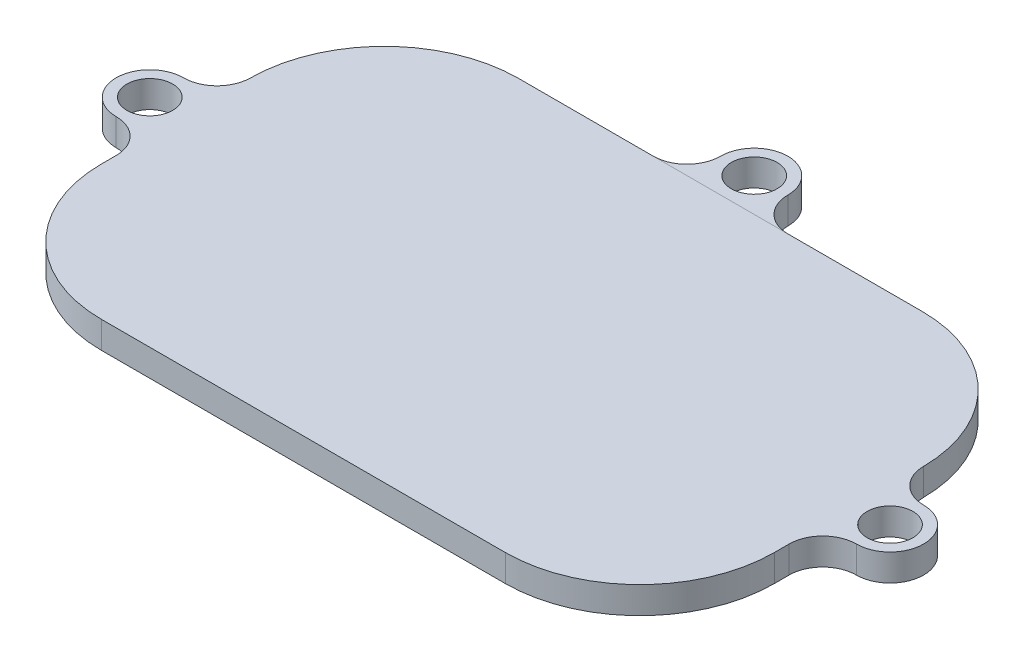
ISO-10303-21;
HEADER;
FILE_DESCRIPTION(('STEP AP214'),'2;1');
FILE_NAME('part.step','',(''),(''),'','','');
FILE_SCHEMA(('AUTOMOTIVE_DESIGN { 1 0 10303 214 1 1 1 1 }'));
ENDSEC;
DATA;
#1=APPLICATION_CONTEXT('core data for automotive mechanical design processes');
#2=APPLICATION_PROTOCOL_DEFINITION('international standard','automotive_design',2000,#1);
#3=PRODUCT_CONTEXT('',#1,'mechanical');
#4=PRODUCT('Part','Part','',(#3));
#5=PRODUCT_RELATED_PRODUCT_CATEGORY('part','',(#4));
#6=PRODUCT_DEFINITION_FORMATION('','',#4);
#7=PRODUCT_DEFINITION_CONTEXT('part definition',#1,'design');
#8=PRODUCT_DEFINITION('design','',#6,#7);
#9=PRODUCT_DEFINITION_SHAPE('','',#8);
#10=(LENGTH_UNIT() NAMED_UNIT(*) SI_UNIT(.MILLI.,.METRE.));
#11=(NAMED_UNIT(*) PLANE_ANGLE_UNIT() SI_UNIT($,.RADIAN.));
#12=(NAMED_UNIT(*) SI_UNIT($,.STERADIAN.) SOLID_ANGLE_UNIT());
#13=UNCERTAINTY_MEASURE_WITH_UNIT(LENGTH_MEASURE(1.E-05),#10,'distance_accuracy_value','');
#14=(GEOMETRIC_REPRESENTATION_CONTEXT(3) GLOBAL_UNCERTAINTY_ASSIGNED_CONTEXT((#13)) GLOBAL_UNIT_ASSIGNED_CONTEXT((#10,
#11,#12)) REPRESENTATION_CONTEXT('',''));
#15=CARTESIAN_POINT('',(0.,0.,0.));
#16=DIRECTION('',(0.,0.,1.));
#17=DIRECTION('',(1.,0.,0.));
#18=AXIS2_PLACEMENT_3D('',#15,#16,#17);
#19=CARTESIAN_POINT('',(-5.,-11.180339887499,-18.));
#20=DIRECTION('',(0.,1.,0.));
#21=DIRECTION('',(0.,0.,1.));
#22=AXIS2_PLACEMENT_3D('',#19,#20,#21);
#23=CYLINDRICAL_SURFACE('',#22,2.5);
#24=CARTESIAN_POINT('',(-5.,0.,-18.));
#25=DIRECTION('',(0.,1.,0.));
#26=DIRECTION('',(0.,0.,1.));
#27=AXIS2_PLACEMENT_3D('',#24,#25,#26);
#28=CIRCLE('',#27,2.5);
#29=CARTESIAN_POINT('',(-5.,0.,-15.5));
#30=VERTEX_POINT('',#29);
#31=CARTESIAN_POINT('',(-2.5,0.,-18.));
#32=VERTEX_POINT('',#31);
#33=EDGE_CURVE('E55',#30,#32,#28,.T.);
#34=ORIENTED_EDGE('',*,*,#33,.F.);
#35=DIRECTION('',(0.,1.,0.));
#36=VECTOR('',#35,1.);
#37=CARTESIAN_POINT('',(-5.,-11.180339887499,-15.5));
#38=LINE('',#37,#36);
#39=CARTESIAN_POINT('',(-5.,2.,-15.5));
#40=VERTEX_POINT('',#39);
#41=EDGE_CURVE('E83',#30,#40,#38,.T.);
#42=ORIENTED_EDGE('',*,*,#41,.T.);
#43=CARTESIAN_POINT('',(-5.,2.,-18.));
#44=DIRECTION('',(0.,-1.,0.));
#45=DIRECTION('',(0.,0.,1.));
#46=AXIS2_PLACEMENT_3D('',#43,#44,#45);
#47=CIRCLE('',#46,2.5);
#48=CARTESIAN_POINT('',(-2.5,2.,-18.));
#49=VERTEX_POINT('',#48);
#50=EDGE_CURVE('E87',#49,#40,#47,.T.);
#51=ORIENTED_EDGE('',*,*,#50,.F.);
#52=DIRECTION('',(0.,1.,0.));
#53=VECTOR('',#52,1.);
#54=CARTESIAN_POINT('',(-2.5,-11.180339887499,-18.));
#55=LINE('',#54,#53);
#56=EDGE_CURVE('E114',#32,#49,#55,.T.);
#57=ORIENTED_EDGE('',*,*,#56,.F.);
#58=EDGE_LOOP('',(#34,#42,#51,#57));
#59=FACE_BOUND('',#58,.T.);
#60=ADVANCED_FACE('F47',(#59),#23,.F.);
#61=CARTESIAN_POINT('',(0.,-11.180339887499,-18.));
#62=DIRECTION('',(0.,1.,0.));
#63=DIRECTION('',(0.,0.,1.));
#64=AXIS2_PLACEMENT_3D('',#61,#62,#63);
#65=CYLINDRICAL_SURFACE('',#64,2.5);
#66=CARTESIAN_POINT('',(0.,0.,-18.));
#67=DIRECTION('',(0.,1.,0.));
#68=DIRECTION('',(0.,0.,1.));
#69=AXIS2_PLACEMENT_3D('',#66,#67,#68);
#70=CIRCLE('',#69,2.5);
#71=CARTESIAN_POINT('',(2.5,0.,-18.));
#72=VERTEX_POINT('',#71);
#73=EDGE_CURVE('E61',#32,#72,#70,.F.);
#74=ORIENTED_EDGE('',*,*,#73,.F.);
#75=ORIENTED_EDGE('',*,*,#56,.T.);
#76=CARTESIAN_POINT('',(0.,2.,-18.));
#77=DIRECTION('',(0.,1.,0.));
#78=DIRECTION('',(0.,0.,1.));
#79=AXIS2_PLACEMENT_3D('',#76,#77,#78);
#80=CIRCLE('',#79,2.5);
#81=CARTESIAN_POINT('',(2.5,2.,-18.));
#82=VERTEX_POINT('',#81);
#83=EDGE_CURVE('E92',#82,#49,#80,.T.);
#84=ORIENTED_EDGE('',*,*,#83,.F.);
#85=DIRECTION('',(0.,1.,0.));
#86=VECTOR('',#85,1.);
#87=CARTESIAN_POINT('',(2.5,-11.180339887499,-18.));
#88=LINE('',#87,#86);
#89=EDGE_CURVE('E117',#72,#82,#88,.T.);
#90=ORIENTED_EDGE('',*,*,#89,.F.);
#91=EDGE_LOOP('',(#74,#75,#84,#90));
#92=FACE_BOUND('',#91,.T.);
#93=ADVANCED_FACE('F123',(#92),#65,.T.);
#94=CARTESIAN_POINT('',(5.,-11.180339887499,-18.));
#95=DIRECTION('',(0.,1.,0.));
#96=DIRECTION('',(0.,0.,1.));
#97=AXIS2_PLACEMENT_3D('',#94,#95,#96);
#98=CYLINDRICAL_SURFACE('',#97,2.5);
#99=CARTESIAN_POINT('',(5.,0.,-18.));
#100=DIRECTION('',(0.,1.,0.));
#101=DIRECTION('',(0.,0.,1.));
#102=AXIS2_PLACEMENT_3D('',#99,#100,#101);
#103=CIRCLE('',#102,2.5);
#104=CARTESIAN_POINT('',(5.,0.,-15.5));
#105=VERTEX_POINT('',#104);
#106=EDGE_CURVE('E116',#72,#105,#103,.T.);
#107=ORIENTED_EDGE('',*,*,#106,.F.);
#108=ORIENTED_EDGE('',*,*,#89,.T.);
#109=CARTESIAN_POINT('',(5.,2.,-18.));
#110=DIRECTION('',(0.,-1.,0.));
#111=DIRECTION('',(0.,0.,-1.));
#112=AXIS2_PLACEMENT_3D('',#109,#110,#111);
#113=CIRCLE('',#112,2.5);
#114=CARTESIAN_POINT('',(5.,2.,-15.5));
#115=VERTEX_POINT('',#114);
#116=EDGE_CURVE('E100',#115,#82,#113,.T.);
#117=ORIENTED_EDGE('',*,*,#116,.F.);
#118=DIRECTION('',(0.,1.,0.));
#119=VECTOR('',#118,1.);
#120=CARTESIAN_POINT('',(5.,-11.180339887499,-15.5));
#121=LINE('',#120,#119);
#122=EDGE_CURVE('E91',#105,#115,#121,.T.);
#123=ORIENTED_EDGE('',*,*,#122,.F.);
#124=EDGE_LOOP('',(#107,#108,#117,#123));
#125=FACE_BOUND('',#124,.T.);
#126=ADVANCED_FACE('F121',(#125),#98,.F.);
#127=CARTESIAN_POINT('',(-5.,-11.180339887499,-15.5));
#128=DIRECTION('',(0.,0.,1.));
#129=DIRECTION('',(1.,0.,0.));
#130=AXIS2_PLACEMENT_3D('',#127,#128,#129);
#131=PLANE('',#130);
#132=DIRECTION('',(-1.,0.,0.));
#133=VECTOR('',#132,1.);
#134=CARTESIAN_POINT('',(-5.,0.,-15.5));
#135=LINE('',#134,#133);
#136=EDGE_CURVE('E12',#105,#30,#135,.T.);
#137=ORIENTED_EDGE('',*,*,#136,.F.);
#138=ORIENTED_EDGE('',*,*,#122,.T.);
#139=DIRECTION('',(1.,0.,0.));
#140=VECTOR('',#139,1.);
#141=CARTESIAN_POINT('',(-5.,2.,-15.5));
#142=LINE('',#141,#140);
#143=EDGE_CURVE('E94',#40,#115,#142,.T.);
#144=ORIENTED_EDGE('',*,*,#143,.F.);
#145=ORIENTED_EDGE('',*,*,#41,.F.);
#146=EDGE_LOOP('',(#137,#138,#144,#145));
#147=FACE_BOUND('',#146,.T.);
#148=ADVANCED_FACE('F95',(#147),#131,.T.);
#149=CARTESIAN_POINT('',(-5.,2.,-18.));
#150=DIRECTION('',(0.,1.,0.));
#151=DIRECTION('',(0.,0.,1.));
#152=AXIS2_PLACEMENT_3D('',#149,#150,#151);
#153=PLANE('',#152);
#154=CARTESIAN_POINT('',(0.,2.,-18.));
#155=DIRECTION('',(0.,1.,0.));
#156=DIRECTION('',(0.,0.,1.));
#157=AXIS2_PLACEMENT_3D('',#154,#155,#156);
#158=CIRCLE('',#157,1.69999999999999);
#159=CARTESIAN_POINT('',(0.,2.,-16.3));
#160=VERTEX_POINT('',#159);
#161=EDGE_CURVE('E107',#160,#160,#158,.T.);
#162=ORIENTED_EDGE('',*,*,#161,.F.);
#163=EDGE_LOOP('',(#162));
#164=FACE_BOUND('',#163,.T.);
#165=ORIENTED_EDGE('',*,*,#50,.T.);
#166=ORIENTED_EDGE('',*,*,#143,.T.);
#167=ORIENTED_EDGE('',*,*,#116,.T.);
#168=ORIENTED_EDGE('',*,*,#83,.T.);
#169=EDGE_LOOP('',(#165,#166,#167,#168));
#170=FACE_BOUND('',#169,.T.);
#171=ADVANCED_FACE('F102',(#164,#170),#153,.T.);
#172=CARTESIAN_POINT('',(0.,0.,0.));
#173=DIRECTION('',(0.,1.,0.));
#174=DIRECTION('',(0.,0.,1.));
#175=AXIS2_PLACEMENT_3D('',#172,#173,#174);
#176=PLANE('',#175);
#177=CARTESIAN_POINT('',(0.,0.,-18.));
#178=DIRECTION('',(0.,1.,0.));
#179=DIRECTION('',(0.,0.,1.));
#180=AXIS2_PLACEMENT_3D('',#177,#178,#179);
#181=CIRCLE('',#180,1.7);
#182=CARTESIAN_POINT('',(0.,0.,-16.3));
#183=VERTEX_POINT('',#182);
#184=EDGE_CURVE('E104',#183,#183,#181,.T.);
#185=ORIENTED_EDGE('',*,*,#184,.T.);
#186=EDGE_LOOP('',(#185));
#187=FACE_BOUND('',#186,.T.);
#188=ORIENTED_EDGE('',*,*,#33,.T.);
#189=ORIENTED_EDGE('',*,*,#73,.T.);
#190=ORIENTED_EDGE('',*,*,#106,.T.);
#191=ORIENTED_EDGE('',*,*,#136,.T.);
#192=EDGE_LOOP('',(#188,#189,#190,#191));
#193=FACE_BOUND('',#192,.T.);
#194=ADVANCED_FACE('F132',(#187,#193),#176,.F.);
#195=CARTESIAN_POINT('',(0.,2.,-18.));
#196=DIRECTION('',(0.,1.,0.));
#197=DIRECTION('',(0.,0.,1.));
#198=AXIS2_PLACEMENT_3D('',#195,#196,#197);
#199=CYLINDRICAL_SURFACE('',#198,1.69999999999999);
#200=ORIENTED_EDGE('',*,*,#184,.F.);
#201=EDGE_LOOP('',(#200));
#202=FACE_BOUND('',#201,.T.);
#203=ORIENTED_EDGE('',*,*,#161,.T.);
#204=EDGE_LOOP('',(#203));
#205=FACE_BOUND('',#204,.T.);
#206=ADVANCED_FACE('F129',(#202,#205),#199,.F.);
#207=CLOSED_SHELL('',(#60,#93,#126,#148,#171,#194,#206));
#208=MANIFOLD_SOLID_BREP('B2',#207);
#209=CARTESIAN_POINT('',(25.,2.,-15.5));
#210=DIRECTION('',(-1.,0.,0.));
#211=DIRECTION('',(0.,0.,1.));
#212=AXIS2_PLACEMENT_3D('',#209,#210,#211);
#213=PLANE('',#212);
#214=DIRECTION('',(0.,0.,-1.));
#215=VECTOR('',#214,1.);
#216=CARTESIAN_POINT('',(25.,2.,-15.5));
#217=LINE('',#216,#215);
#218=CARTESIAN_POINT('',(25.,2.,5.5));
#219=VERTEX_POINT('',#218);
#220=CARTESIAN_POINT('',(25.,2.,4.41034837561365));
#221=VERTEX_POINT('',#220);
#222=EDGE_CURVE('E353',#219,#221,#217,.T.);
#223=ORIENTED_EDGE('',*,*,#222,.F.);
#224=DIRECTION('',(0.,-1.,0.));
#225=VECTOR('',#224,1.);
#226=CARTESIAN_POINT('',(25.,2.,5.5));
#227=LINE('',#226,#225);
#228=CARTESIAN_POINT('',(25.,0.,5.5));
#229=VERTEX_POINT('',#228);
#230=EDGE_CURVE('E362',#219,#229,#227,.T.);
#231=ORIENTED_EDGE('',*,*,#230,.T.);
#232=DIRECTION('',(0.,0.,-1.));
#233=VECTOR('',#232,1.);
#234=CARTESIAN_POINT('',(25.,0.,-15.5));
#235=LINE('',#234,#233);
#236=CARTESIAN_POINT('',(25.,0.,4.41034837561365));
#237=VERTEX_POINT('',#236);
#238=EDGE_CURVE('E352',#229,#237,#235,.T.);
#239=ORIENTED_EDGE('',*,*,#238,.T.);
#240=DIRECTION('',(0.,1.,0.));
#241=VECTOR('',#240,1.);
#242=CARTESIAN_POINT('',(25.,-11.1803398874989,4.41034837561365));
#243=LINE('',#242,#241);
#244=EDGE_CURVE('E347',#237,#221,#243,.T.);
#245=ORIENTED_EDGE('',*,*,#244,.T.);
#246=EDGE_LOOP('',(#223,#231,#239,#245));
#247=FACE_BOUND('',#246,.T.);
#248=ADVANCED_FACE('F192',(#247),#213,.F.);
#249=CARTESIAN_POINT('',(-25.,2.,-15.5));
#250=DIRECTION('',(0.,0.,1.));
#251=DIRECTION('',(1.,0.,0.));
#252=AXIS2_PLACEMENT_3D('',#249,#250,#251);
#253=PLANE('',#252);
#254=DIRECTION('',(-1.,0.,0.));
#255=VECTOR('',#254,1.);
#256=CARTESIAN_POINT('',(-25.,2.,-15.5));
#257=LINE('',#256,#255);
#258=CARTESIAN_POINT('',(15.0003215006848,2.,-15.5));
#259=VERTEX_POINT('',#258);
#260=CARTESIAN_POINT('',(-15.0003215006848,2.,-15.5));
#261=VERTEX_POINT('',#260);
#262=EDGE_CURVE('E355',#259,#261,#257,.T.);
#263=ORIENTED_EDGE('',*,*,#262,.F.);
#264=DIRECTION('',(0.,-1.,0.));
#265=VECTOR('',#264,1.);
#266=CARTESIAN_POINT('',(15.0003215006848,0.,-15.5));
#267=LINE('',#266,#265);
#268=CARTESIAN_POINT('',(15.0003215006848,0.,-15.5));
#269=VERTEX_POINT('',#268);
#270=EDGE_CURVE('E396',#259,#269,#267,.T.);
#271=ORIENTED_EDGE('',*,*,#270,.T.);
#272=DIRECTION('',(-1.,0.,0.));
#273=VECTOR('',#272,1.);
#274=CARTESIAN_POINT('',(-25.,0.,-15.5));
#275=LINE('',#274,#273);
#276=CARTESIAN_POINT('',(-15.0003215006848,0.,-15.5));
#277=VERTEX_POINT('',#276);
#278=EDGE_CURVE('E364',#269,#277,#275,.T.);
#279=ORIENTED_EDGE('',*,*,#278,.T.);
#280=DIRECTION('',(0.,-1.,0.));
#281=VECTOR('',#280,1.);
#282=CARTESIAN_POINT('',(-15.0003215006848,2.,-15.5));
#283=LINE('',#282,#281);
#284=EDGE_CURVE('E394',#277,#261,#283,.F.);
#285=ORIENTED_EDGE('',*,*,#284,.T.);
#286=EDGE_LOOP('',(#263,#271,#279,#285));
#287=FACE_BOUND('',#286,.T.);
#288=ADVANCED_FACE('F412',(#287),#253,.F.);
#289=CARTESIAN_POINT('',(-25.,2.,-15.5));
#290=DIRECTION('',(1.,0.,0.));
#291=DIRECTION('',(0.,0.,-1.));
#292=AXIS2_PLACEMENT_3D('',#289,#290,#291);
#293=PLANE('',#292);
#294=DIRECTION('',(0.,0.,1.));
#295=VECTOR('',#294,1.);
#296=CARTESIAN_POINT('',(-25.,0.,-15.5));
#297=LINE('',#296,#295);
#298=CARTESIAN_POINT('',(-25.,0.,4.41034837561365));
#299=VERTEX_POINT('',#298);
#300=CARTESIAN_POINT('',(-25.,0.,5.5));
#301=VERTEX_POINT('',#300);
#302=EDGE_CURVE('E367',#299,#301,#297,.T.);
#303=ORIENTED_EDGE('',*,*,#302,.T.);
#304=DIRECTION('',(0.,-1.,0.));
#305=VECTOR('',#304,1.);
#306=CARTESIAN_POINT('',(-25.,2.,5.5));
#307=LINE('',#306,#305);
#308=CARTESIAN_POINT('',(-25.,2.,5.5));
#309=VERTEX_POINT('',#308);
#310=EDGE_CURVE('E207',#301,#309,#307,.F.);
#311=ORIENTED_EDGE('',*,*,#310,.T.);
#312=DIRECTION('',(0.,0.,1.));
#313=VECTOR('',#312,1.);
#314=CARTESIAN_POINT('',(-25.,2.,-15.5));
#315=LINE('',#314,#313);
#316=CARTESIAN_POINT('',(-25.,2.,4.41034837561365));
#317=VERTEX_POINT('',#316);
#318=EDGE_CURVE('E358',#317,#309,#315,.T.);
#319=ORIENTED_EDGE('',*,*,#318,.F.);
#320=DIRECTION('',(0.,1.,0.));
#321=VECTOR('',#320,1.);
#322=CARTESIAN_POINT('',(-25.,-11.1803398874989,4.41034837561365));
#323=LINE('',#322,#321);
#324=EDGE_CURVE('E322',#299,#317,#323,.T.);
#325=ORIENTED_EDGE('',*,*,#324,.F.);
#326=EDGE_LOOP('',(#303,#311,#319,#325));
#327=FACE_BOUND('',#326,.T.);
#328=ADVANCED_FACE('F429',(#327),#293,.F.);
#329=CARTESIAN_POINT('',(-25.,2.,15.5));
#330=DIRECTION('',(0.,0.,-1.));
#331=DIRECTION('',(-1.,0.,0.));
#332=AXIS2_PLACEMENT_3D('',#329,#330,#331);
#333=PLANE('',#332);
#334=DIRECTION('',(1.,0.,0.));
#335=VECTOR('',#334,1.);
#336=CARTESIAN_POINT('',(-25.,0.,15.5));
#337=LINE('',#336,#335);
#338=CARTESIAN_POINT('',(-15.,0.,15.5));
#339=VERTEX_POINT('',#338);
#340=CARTESIAN_POINT('',(15.,0.,15.5));
#341=VERTEX_POINT('',#340);
#342=EDGE_CURVE('E356',#339,#341,#337,.T.);
#343=ORIENTED_EDGE('',*,*,#342,.T.);
#344=DIRECTION('',(0.,-1.,0.));
#345=VECTOR('',#344,1.);
#346=CARTESIAN_POINT('',(15.,2.,15.5));
#347=LINE('',#346,#345);
#348=CARTESIAN_POINT('',(15.,2.,15.5));
#349=VERTEX_POINT('',#348);
#350=EDGE_CURVE('E384',#341,#349,#347,.F.);
#351=ORIENTED_EDGE('',*,*,#350,.T.);
#352=DIRECTION('',(1.,0.,0.));
#353=VECTOR('',#352,1.);
#354=CARTESIAN_POINT('',(-25.,2.,15.5));
#355=LINE('',#354,#353);
#356=CARTESIAN_POINT('',(-15.,2.,15.5));
#357=VERTEX_POINT('',#356);
#358=EDGE_CURVE('E360',#357,#349,#355,.T.);
#359=ORIENTED_EDGE('',*,*,#358,.F.);
#360=DIRECTION('',(0.,-1.,0.));
#361=VECTOR('',#360,1.);
#362=CARTESIAN_POINT('',(-15.,2.,15.5));
#363=LINE('',#362,#361);
#364=EDGE_CURVE('E381',#357,#339,#363,.T.);
#365=ORIENTED_EDGE('',*,*,#364,.T.);
#366=EDGE_LOOP('',(#343,#351,#359,#365));
#367=FACE_BOUND('',#366,.T.);
#368=ADVANCED_FACE('F448',(#367),#333,.F.);
#369=CARTESIAN_POINT('',(0.,2.,0.));
#370=DIRECTION('',(0.,1.,0.));
#371=DIRECTION('',(0.,0.,1.));
#372=AXIS2_PLACEMENT_3D('',#369,#370,#371);
#373=PLANE('',#372);
#374=CARTESIAN_POINT('',(-27.5,2.,-0.589651624386345));
#375=DIRECTION('',(0.,1.,0.));
#376=DIRECTION('',(0.,0.,1.));
#377=AXIS2_PLACEMENT_3D('',#374,#375,#376);
#378=CIRCLE('',#377,1.69999999999999);
#379=CARTESIAN_POINT('',(-27.5,2.,1.11034837561364));
#380=VERTEX_POINT('',#379);
#381=EDGE_CURVE('E475',#380,#380,#378,.T.);
#382=ORIENTED_EDGE('',*,*,#381,.F.);
#383=EDGE_LOOP('',(#382));
#384=FACE_BOUND('',#383,.T.);
#385=CARTESIAN_POINT('',(27.5,2.,-0.589651624386352));
#386=DIRECTION('',(0.,1.,0.));
#387=DIRECTION('',(0.,0.,1.));
#388=AXIS2_PLACEMENT_3D('',#385,#386,#387);
#389=CIRCLE('',#388,1.69999999999999);
#390=CARTESIAN_POINT('',(27.5,2.,1.11034837561364));
#391=VERTEX_POINT('',#390);
#392=EDGE_CURVE('E469',#391,#391,#389,.T.);
#393=ORIENTED_EDGE('',*,*,#392,.F.);
#394=EDGE_LOOP('',(#393));
#395=FACE_BOUND('',#394,.T.);
#396=ORIENTED_EDGE('',*,*,#358,.T.);
#397=CARTESIAN_POINT('',(15.,2.,5.5));
#398=DIRECTION('',(0.,1.,0.));
#399=DIRECTION('',(0.,0.,1.));
#400=AXIS2_PLACEMENT_3D('',#397,#398,#399);
#401=CIRCLE('',#400,10.);
#402=EDGE_CURVE('E391',#349,#219,#401,.T.);
#403=ORIENTED_EDGE('',*,*,#402,.T.);
#404=ORIENTED_EDGE('',*,*,#222,.T.);
#405=CARTESIAN_POINT('',(27.5,2.,4.41034837561365));
#406=DIRECTION('',(0.,-1.,0.));
#407=DIRECTION('',(0.,0.,-1.));
#408=AXIS2_PLACEMENT_3D('',#405,#406,#407);
#409=CIRCLE('',#408,2.5);
#410=CARTESIAN_POINT('',(27.5,2.,1.91034837561365));
#411=VERTEX_POINT('',#410);
#412=EDGE_CURVE('E342',#221,#411,#409,.T.);
#413=ORIENTED_EDGE('',*,*,#412,.T.);
#414=CARTESIAN_POINT('',(27.5,2.,-0.589651624386352));
#415=DIRECTION('',(0.,1.,0.));
#416=DIRECTION('',(0.,0.,-1.));
#417=AXIS2_PLACEMENT_3D('',#414,#415,#416);
#418=CIRCLE('',#417,2.5);
#419=CARTESIAN_POINT('',(27.5,2.,-3.08965162438635));
#420=VERTEX_POINT('',#419);
#421=EDGE_CURVE('E329',#411,#420,#418,.T.);
#422=ORIENTED_EDGE('',*,*,#421,.T.);
#423=CARTESIAN_POINT('',(27.5,2.,-5.58965162438635));
#424=DIRECTION('',(0.,-1.,0.));
#425=DIRECTION('',(0.,0.,-1.));
#426=AXIS2_PLACEMENT_3D('',#423,#424,#425);
#427=CIRCLE('',#426,2.5);
#428=CARTESIAN_POINT('',(25.000064300137,2.,-5.57172129950908));
#429=VERTEX_POINT('',#428);
#430=EDGE_CURVE('E339',#420,#429,#427,.T.);
#431=ORIENTED_EDGE('',*,*,#430,.T.);
#432=CARTESIAN_POINT('',(15.0003215006848,2.,-5.5));
#433=DIRECTION('',(0.,1.,0.));
#434=DIRECTION('',(0.,0.,1.));
#435=AXIS2_PLACEMENT_3D('',#432,#433,#434);
#436=CIRCLE('',#435,10.);
#437=EDGE_CURVE('E387',#429,#259,#436,.T.);
#438=ORIENTED_EDGE('',*,*,#437,.T.);
#439=ORIENTED_EDGE('',*,*,#262,.T.);
#440=CARTESIAN_POINT('',(-15.0003215006848,2.,-5.5));
#441=DIRECTION('',(0.,1.,0.));
#442=DIRECTION('',(0.,0.,1.));
#443=AXIS2_PLACEMENT_3D('',#440,#441,#442);
#444=CIRCLE('',#443,10.);
#445=CARTESIAN_POINT('',(-25.000064300137,2.,-5.57172129950907));
#446=VERTEX_POINT('',#445);
#447=EDGE_CURVE('E215',#261,#446,#444,.T.);
#448=ORIENTED_EDGE('',*,*,#447,.T.);
#449=CARTESIAN_POINT('',(-27.5,2.,-5.58965162438634));
#450=DIRECTION('',(0.,-1.,0.));
#451=DIRECTION('',(0.,0.,1.));
#452=AXIS2_PLACEMENT_3D('',#449,#450,#451);
#453=CIRCLE('',#452,2.5);
#454=CARTESIAN_POINT('',(-27.5,2.,-3.08965162438634));
#455=VERTEX_POINT('',#454);
#456=EDGE_CURVE('E293',#446,#455,#453,.T.);
#457=ORIENTED_EDGE('',*,*,#456,.T.);
#458=CARTESIAN_POINT('',(-27.5,2.,-0.589651624386345));
#459=DIRECTION('',(0.,1.,0.));
#460=DIRECTION('',(0.,0.,1.));
#461=AXIS2_PLACEMENT_3D('',#458,#459,#460);
#462=CIRCLE('',#461,2.5);
#463=CARTESIAN_POINT('',(-27.5,2.,1.91034837561365));
#464=VERTEX_POINT('',#463);
#465=EDGE_CURVE('E299',#455,#464,#462,.T.);
#466=ORIENTED_EDGE('',*,*,#465,.T.);
#467=CARTESIAN_POINT('',(-27.5,2.,4.41034837561365));
#468=DIRECTION('',(0.,-1.,0.));
#469=DIRECTION('',(0.,0.,1.));
#470=AXIS2_PLACEMENT_3D('',#467,#468,#469);
#471=CIRCLE('',#470,2.5);
#472=EDGE_CURVE('E313',#464,#317,#471,.T.);
#473=ORIENTED_EDGE('',*,*,#472,.T.);
#474=ORIENTED_EDGE('',*,*,#318,.T.);
#475=CARTESIAN_POINT('',(-15.,2.,5.5));
#476=DIRECTION('',(0.,1.,0.));
#477=DIRECTION('',(0.,0.,1.));
#478=AXIS2_PLACEMENT_3D('',#475,#476,#477);
#479=CIRCLE('',#478,10.);
#480=EDGE_CURVE('E389',#309,#357,#479,.T.);
#481=ORIENTED_EDGE('',*,*,#480,.T.);
#482=EDGE_LOOP('',(#396,#403,#404,#413,#422,#431,#438,#439,#448,#457,#466,#473,#474,#481));
#483=FACE_BOUND('',#482,.T.);
#484=ADVANCED_FACE('F296',(#384,#395,#483),#373,.T.);
#485=CARTESIAN_POINT('',(0.,0.,0.));
#486=DIRECTION('',(0.,1.,0.));
#487=DIRECTION('',(0.,0.,1.));
#488=AXIS2_PLACEMENT_3D('',#485,#486,#487);
#489=PLANE('',#488);
#490=CARTESIAN_POINT('',(-27.5,0.,-0.589651624386345));
#491=DIRECTION('',(0.,1.,0.));
#492=DIRECTION('',(0.,0.,1.));
#493=AXIS2_PLACEMENT_3D('',#490,#491,#492);
#494=CIRCLE('',#493,1.7);
#495=CARTESIAN_POINT('',(-27.5,0.,1.11034837561365));
#496=VERTEX_POINT('',#495);
#497=EDGE_CURVE('E472',#496,#496,#494,.T.);
#498=ORIENTED_EDGE('',*,*,#497,.T.);
#499=EDGE_LOOP('',(#498));
#500=FACE_BOUND('',#499,.T.);
#501=CARTESIAN_POINT('',(27.5,0.,-0.589651624386352));
#502=DIRECTION('',(0.,1.,0.));
#503=DIRECTION('',(0.,0.,1.));
#504=AXIS2_PLACEMENT_3D('',#501,#502,#503);
#505=CIRCLE('',#504,1.7);
#506=CARTESIAN_POINT('',(27.5,0.,1.11034837561365));
#507=VERTEX_POINT('',#506);
#508=EDGE_CURVE('E302',#507,#507,#505,.T.);
#509=ORIENTED_EDGE('',*,*,#508,.T.);
#510=EDGE_LOOP('',(#509));
#511=FACE_BOUND('',#510,.T.);
#512=ORIENTED_EDGE('',*,*,#238,.F.);
#513=CARTESIAN_POINT('',(15.,0.,5.5));
#514=DIRECTION('',(0.,1.,0.));
#515=DIRECTION('',(0.,0.,1.));
#516=AXIS2_PLACEMENT_3D('',#513,#514,#515);
#517=CIRCLE('',#516,10.);
#518=EDGE_CURVE('E379',#229,#341,#517,.F.);
#519=ORIENTED_EDGE('',*,*,#518,.T.);
#520=ORIENTED_EDGE('',*,*,#342,.F.);
#521=CARTESIAN_POINT('',(-15.,0.,5.5));
#522=DIRECTION('',(0.,1.,0.));
#523=DIRECTION('',(0.,0.,1.));
#524=AXIS2_PLACEMENT_3D('',#521,#522,#523);
#525=CIRCLE('',#524,10.);
#526=EDGE_CURVE('E377',#339,#301,#525,.F.);
#527=ORIENTED_EDGE('',*,*,#526,.T.);
#528=ORIENTED_EDGE('',*,*,#302,.F.);
#529=CARTESIAN_POINT('',(-27.5,0.,4.41034837561365));
#530=DIRECTION('',(0.,1.,0.));
#531=DIRECTION('',(0.,0.,1.));
#532=AXIS2_PLACEMENT_3D('',#529,#530,#531);
#533=CIRCLE('',#532,2.5);
#534=CARTESIAN_POINT('',(-27.5,0.,1.91034837561365));
#535=VERTEX_POINT('',#534);
#536=EDGE_CURVE('E325',#299,#535,#533,.T.);
#537=ORIENTED_EDGE('',*,*,#536,.T.);
#538=CARTESIAN_POINT('',(-27.5,0.,-0.589651624386345));
#539=DIRECTION('',(0.,1.,0.));
#540=DIRECTION('',(0.,0.,1.));
#541=AXIS2_PLACEMENT_3D('',#538,#539,#540);
#542=CIRCLE('',#541,2.5);
#543=CARTESIAN_POINT('',(-27.5,0.,-3.08965162438634));
#544=VERTEX_POINT('',#543);
#545=EDGE_CURVE('E327',#535,#544,#542,.F.);
#546=ORIENTED_EDGE('',*,*,#545,.T.);
#547=CARTESIAN_POINT('',(-27.5,0.,-5.58965162438634));
#548=DIRECTION('',(0.,1.,0.));
#549=DIRECTION('',(0.,0.,1.));
#550=AXIS2_PLACEMENT_3D('',#547,#548,#549);
#551=CIRCLE('',#550,2.5);
#552=CARTESIAN_POINT('',(-25.000064300137,0.,-5.57172129950907));
#553=VERTEX_POINT('',#552);
#554=EDGE_CURVE('E309',#544,#553,#551,.T.);
#555=ORIENTED_EDGE('',*,*,#554,.T.);
#556=CARTESIAN_POINT('',(-15.0003215006848,0.,-5.5));
#557=DIRECTION('',(0.,1.,0.));
#558=DIRECTION('',(0.,0.,1.));
#559=AXIS2_PLACEMENT_3D('',#556,#557,#558);
#560=CIRCLE('',#559,10.);
#561=EDGE_CURVE('E373',#553,#277,#560,.F.);
#562=ORIENTED_EDGE('',*,*,#561,.T.);
#563=ORIENTED_EDGE('',*,*,#278,.F.);
#564=CARTESIAN_POINT('',(15.0003215006848,0.,-5.5));
#565=DIRECTION('',(0.,1.,0.));
#566=DIRECTION('',(0.,0.,1.));
#567=AXIS2_PLACEMENT_3D('',#564,#565,#566);
#568=CIRCLE('',#567,10.);
#569=CARTESIAN_POINT('',(25.000064300137,0.,-5.57172129950908));
#570=VERTEX_POINT('',#569);
#571=EDGE_CURVE('E375',#269,#570,#568,.F.);
#572=ORIENTED_EDGE('',*,*,#571,.T.);
#573=CARTESIAN_POINT('',(27.5,0.,-5.58965162438635));
#574=DIRECTION('',(0.,1.,0.));
#575=DIRECTION('',(0.,0.,1.));
#576=AXIS2_PLACEMENT_3D('',#573,#574,#575);
#577=CIRCLE('',#576,2.5);
#578=CARTESIAN_POINT('',(27.5,0.,-3.08965162438635));
#579=VERTEX_POINT('',#578);
#580=EDGE_CURVE('E336',#570,#579,#577,.T.);
#581=ORIENTED_EDGE('',*,*,#580,.T.);
#582=CARTESIAN_POINT('',(27.5,0.,-0.589651624386352));
#583=DIRECTION('',(0.,1.,0.));
#584=DIRECTION('',(0.,0.,1.));
#585=AXIS2_PLACEMENT_3D('',#582,#583,#584);
#586=CIRCLE('',#585,2.5);
#587=CARTESIAN_POINT('',(27.5,0.,1.91034837561365));
#588=VERTEX_POINT('',#587);
#589=EDGE_CURVE('E333',#579,#588,#586,.F.);
#590=ORIENTED_EDGE('',*,*,#589,.T.);
#591=CARTESIAN_POINT('',(27.5,0.,4.41034837561365));
#592=DIRECTION('',(0.,1.,0.));
#593=DIRECTION('',(0.,0.,1.));
#594=AXIS2_PLACEMENT_3D('',#591,#592,#593);
#595=CIRCLE('',#594,2.5);
#596=EDGE_CURVE('E330',#588,#237,#595,.T.);
#597=ORIENTED_EDGE('',*,*,#596,.T.);
#598=EDGE_LOOP('',(#512,#519,#520,#527,#528,#537,#546,#555,#562,#563,#572,#581,#590,#597));
#599=FACE_BOUND('',#598,.T.);
#600=ADVANCED_FACE('F416',(#500,#511,#599),#489,.F.);
#601=CARTESIAN_POINT('',(27.5,-11.1803398874989,-0.589651624386352));
#602=DIRECTION('',(0.,1.,0.));
#603=DIRECTION('',(0.,0.,1.));
#604=AXIS2_PLACEMENT_3D('',#601,#602,#603);
#605=CYLINDRICAL_SURFACE('',#604,2.5);
#606=ORIENTED_EDGE('',*,*,#589,.F.);
#607=DIRECTION('',(0.,1.,0.));
#608=VECTOR('',#607,1.);
#609=CARTESIAN_POINT('',(27.5,-11.1803398874989,-3.08965162438635));
#610=LINE('',#609,#608);
#611=EDGE_CURVE('E345',#579,#420,#610,.T.);
#612=ORIENTED_EDGE('',*,*,#611,.T.);
#613=ORIENTED_EDGE('',*,*,#421,.F.);
#614=DIRECTION('',(0.,1.,0.));
#615=VECTOR('',#614,1.);
#616=CARTESIAN_POINT('',(27.5,-11.1803398874989,1.91034837561365));
#617=LINE('',#616,#615);
#618=EDGE_CURVE('E334',#588,#411,#617,.T.);
#619=ORIENTED_EDGE('',*,*,#618,.F.);
#620=EDGE_LOOP('',(#606,#612,#613,#619));
#621=FACE_BOUND('',#620,.T.);
#622=ADVANCED_FACE('F460',(#621),#605,.T.);
#623=CARTESIAN_POINT('',(27.5,-11.1803398874989,4.41034837561365));
#624=DIRECTION('',(0.,1.,0.));
#625=DIRECTION('',(0.,0.,1.));
#626=AXIS2_PLACEMENT_3D('',#623,#624,#625);
#627=CYLINDRICAL_SURFACE('',#626,2.5);
#628=ORIENTED_EDGE('',*,*,#596,.F.);
#629=ORIENTED_EDGE('',*,*,#618,.T.);
#630=ORIENTED_EDGE('',*,*,#412,.F.);
#631=ORIENTED_EDGE('',*,*,#244,.F.);
#632=EDGE_LOOP('',(#628,#629,#630,#631));
#633=FACE_BOUND('',#632,.T.);
#634=ADVANCED_FACE('F456',(#633),#627,.F.);
#635=CARTESIAN_POINT('',(27.5,-11.1803398874989,-5.58965162438635));
#636=DIRECTION('',(0.,1.,0.));
#637=DIRECTION('',(0.,0.,1.));
#638=AXIS2_PLACEMENT_3D('',#635,#636,#637);
#639=CYLINDRICAL_SURFACE('',#638,2.5);
#640=ORIENTED_EDGE('',*,*,#580,.F.);
#641=DIRECTION('',(0.,1.,0.));
#642=VECTOR('',#641,1.);
#643=CARTESIAN_POINT('',(25.000064300137,-11.1803398874989,-5.57172129950908));
#644=LINE('',#643,#642);
#645=EDGE_CURVE('E200',#570,#429,#644,.T.);
#646=ORIENTED_EDGE('',*,*,#645,.T.);
#647=ORIENTED_EDGE('',*,*,#430,.F.);
#648=ORIENTED_EDGE('',*,*,#611,.F.);
#649=EDGE_LOOP('',(#640,#646,#647,#648));
#650=FACE_BOUND('',#649,.T.);
#651=ADVANCED_FACE('F402',(#650),#639,.F.);
#652=CARTESIAN_POINT('',(-27.5,-11.1803398874989,-5.58965162438634));
#653=DIRECTION('',(0.,1.,0.));
#654=DIRECTION('',(0.,0.,1.));
#655=AXIS2_PLACEMENT_3D('',#652,#653,#654);
#656=CYLINDRICAL_SURFACE('',#655,2.5);
#657=ORIENTED_EDGE('',*,*,#456,.F.);
#658=DIRECTION('',(0.,1.,0.));
#659=VECTOR('',#658,1.);
#660=CARTESIAN_POINT('',(-25.000064300137,-11.1803398874989,-5.57172129950907));
#661=LINE('',#660,#659);
#662=EDGE_CURVE('E45',#446,#553,#661,.F.);
#663=ORIENTED_EDGE('',*,*,#662,.T.);
#664=ORIENTED_EDGE('',*,*,#554,.F.);
#665=DIRECTION('',(0.,1.,0.));
#666=VECTOR('',#665,1.);
#667=CARTESIAN_POINT('',(-27.5,-11.1803398874989,-3.08965162438634));
#668=LINE('',#667,#666);
#669=EDGE_CURVE('E306',#544,#455,#668,.T.);
#670=ORIENTED_EDGE('',*,*,#669,.T.);
#671=EDGE_LOOP('',(#657,#663,#664,#670));
#672=FACE_BOUND('',#671,.T.);
#673=ADVANCED_FACE('F307',(#672),#656,.F.);
#674=CARTESIAN_POINT('',(-27.5,-11.1803398874989,4.41034837561365));
#675=DIRECTION('',(0.,1.,0.));
#676=DIRECTION('',(0.,0.,1.));
#677=AXIS2_PLACEMENT_3D('',#674,#675,#676);
#678=CYLINDRICAL_SURFACE('',#677,2.5);
#679=ORIENTED_EDGE('',*,*,#536,.F.);
#680=ORIENTED_EDGE('',*,*,#324,.T.);
#681=ORIENTED_EDGE('',*,*,#472,.F.);
#682=DIRECTION('',(0.,1.,0.));
#683=VECTOR('',#682,1.);
#684=CARTESIAN_POINT('',(-27.5,-11.1803398874989,1.91034837561365));
#685=LINE('',#684,#683);
#686=EDGE_CURVE('E312',#535,#464,#685,.T.);
#687=ORIENTED_EDGE('',*,*,#686,.F.);
#688=EDGE_LOOP('',(#679,#680,#681,#687));
#689=FACE_BOUND('',#688,.T.);
#690=ADVANCED_FACE('F464',(#689),#678,.F.);
#691=CARTESIAN_POINT('',(-27.5,-11.1803398874989,-0.589651624386345));
#692=DIRECTION('',(0.,1.,0.));
#693=DIRECTION('',(0.,0.,1.));
#694=AXIS2_PLACEMENT_3D('',#691,#692,#693);
#695=CYLINDRICAL_SURFACE('',#694,2.5);
#696=ORIENTED_EDGE('',*,*,#545,.F.);
#697=ORIENTED_EDGE('',*,*,#686,.T.);
#698=ORIENTED_EDGE('',*,*,#465,.F.);
#699=ORIENTED_EDGE('',*,*,#669,.F.);
#700=EDGE_LOOP('',(#696,#697,#698,#699));
#701=FACE_BOUND('',#700,.T.);
#702=ADVANCED_FACE('F315',(#701),#695,.T.);
#703=CARTESIAN_POINT('',(27.5,2.,-0.589651624386352));
#704=DIRECTION('',(0.,1.,0.));
#705=DIRECTION('',(0.,0.,1.));
#706=AXIS2_PLACEMENT_3D('',#703,#704,#705);
#707=CYLINDRICAL_SURFACE('',#706,1.69999999999999);
#708=ORIENTED_EDGE('',*,*,#508,.F.);
#709=EDGE_LOOP('',(#708));
#710=FACE_BOUND('',#709,.T.);
#711=ORIENTED_EDGE('',*,*,#392,.T.);
#712=EDGE_LOOP('',(#711));
#713=FACE_BOUND('',#712,.T.);
#714=ADVANCED_FACE('F485',(#710,#713),#707,.F.);
#715=CARTESIAN_POINT('',(-27.5,2.,-0.589651624386345));
#716=DIRECTION('',(0.,1.,0.));
#717=DIRECTION('',(0.,0.,1.));
#718=AXIS2_PLACEMENT_3D('',#715,#716,#717);
#719=CYLINDRICAL_SURFACE('',#718,1.69999999999999);
#720=ORIENTED_EDGE('',*,*,#497,.F.);
#721=EDGE_LOOP('',(#720));
#722=FACE_BOUND('',#721,.T.);
#723=ORIENTED_EDGE('',*,*,#381,.T.);
#724=EDGE_LOOP('',(#723));
#725=FACE_BOUND('',#724,.T.);
#726=ADVANCED_FACE('F437',(#722,#725),#719,.F.);
#727=CARTESIAN_POINT('',(15.,2.,5.5));
#728=DIRECTION('',(0.,-1.,0.));
#729=DIRECTION('',(0.,0.,-1.));
#730=AXIS2_PLACEMENT_3D('',#727,#728,#729);
#731=CYLINDRICAL_SURFACE('',#730,10.);
#732=ORIENTED_EDGE('',*,*,#402,.F.);
#733=ORIENTED_EDGE('',*,*,#350,.F.);
#734=ORIENTED_EDGE('',*,*,#518,.F.);
#735=ORIENTED_EDGE('',*,*,#230,.F.);
#736=EDGE_LOOP('',(#732,#733,#734,#735));
#737=FACE_BOUND('',#736,.T.);
#738=ADVANCED_FACE('F434',(#737),#731,.T.);
#739=CARTESIAN_POINT('',(-15.,2.,5.5));
#740=DIRECTION('',(0.,-1.,0.));
#741=DIRECTION('',(0.,0.,-1.));
#742=AXIS2_PLACEMENT_3D('',#739,#740,#741);
#743=CYLINDRICAL_SURFACE('',#742,10.);
#744=ORIENTED_EDGE('',*,*,#480,.F.);
#745=ORIENTED_EDGE('',*,*,#310,.F.);
#746=ORIENTED_EDGE('',*,*,#526,.F.);
#747=ORIENTED_EDGE('',*,*,#364,.F.);
#748=EDGE_LOOP('',(#744,#745,#746,#747));
#749=FACE_BOUND('',#748,.T.);
#750=ADVANCED_FACE('F422',(#749),#743,.T.);
#751=CARTESIAN_POINT('',(15.0003215006848,-11.1803398874989,-5.5));
#752=DIRECTION('',(0.,1.,0.));
#753=DIRECTION('',(0.,0.,1.));
#754=AXIS2_PLACEMENT_3D('',#751,#752,#753);
#755=CYLINDRICAL_SURFACE('',#754,10.);
#756=ORIENTED_EDGE('',*,*,#437,.F.);
#757=ORIENTED_EDGE('',*,*,#645,.F.);
#758=ORIENTED_EDGE('',*,*,#571,.F.);
#759=ORIENTED_EDGE('',*,*,#270,.F.);
#760=EDGE_LOOP('',(#756,#757,#758,#759));
#761=FACE_BOUND('',#760,.T.);
#762=ADVANCED_FACE('F409',(#761),#755,.T.);
#763=CARTESIAN_POINT('',(-15.0003215006848,-11.1803398874989,-5.5));
#764=DIRECTION('',(0.,1.,0.));
#765=DIRECTION('',(0.,0.,1.));
#766=AXIS2_PLACEMENT_3D('',#763,#764,#765);
#767=CYLINDRICAL_SURFACE('',#766,10.);
#768=ORIENTED_EDGE('',*,*,#447,.F.);
#769=ORIENTED_EDGE('',*,*,#284,.F.);
#770=ORIENTED_EDGE('',*,*,#561,.F.);
#771=ORIENTED_EDGE('',*,*,#662,.F.);
#772=EDGE_LOOP('',(#768,#769,#770,#771));
#773=FACE_BOUND('',#772,.T.);
#774=ADVANCED_FACE('F194',(#773),#767,.T.);
#775=CLOSED_SHELL('',(#248,#288,#328,#368,#484,#600,#622,#634,#651,#673,#690,#702,#714,#726,
#738,#750,#762,#774));
#776=MANIFOLD_SOLID_BREP('B6',#775);
#777=ADVANCED_BREP_SHAPE_REPRESENTATION('',(#18,#208,#776),#14);
#778=SHAPE_DEFINITION_REPRESENTATION(#9,#777);
ENDSEC;
END-ISO-10303-21;
